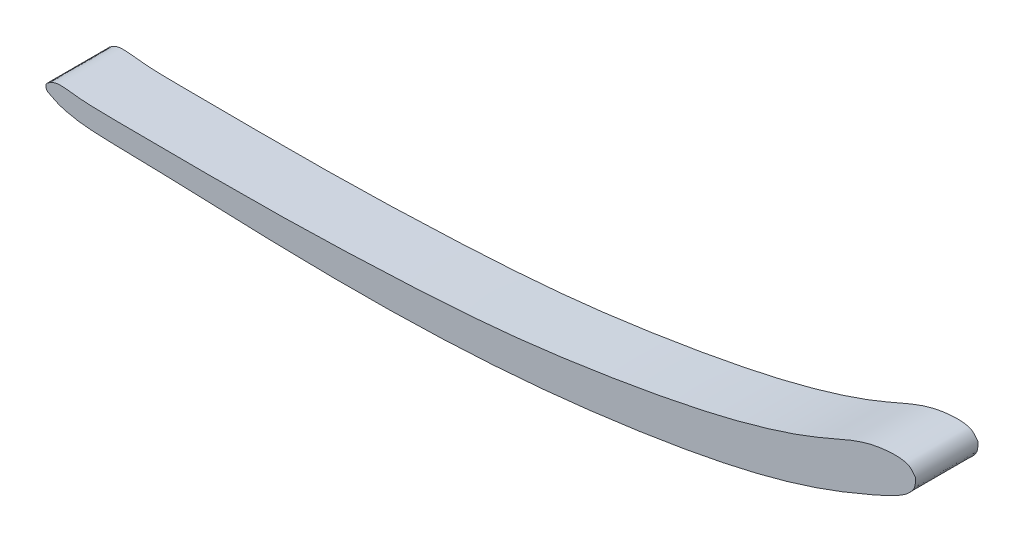
ISO-10303-21;
HEADER;
FILE_DESCRIPTION(('STEP AP214'),'2;1');
FILE_NAME('part.step','',(''),(''),'','','');
FILE_SCHEMA(('AUTOMOTIVE_DESIGN { 1 0 10303 214 1 1 1 1 }'));
ENDSEC;
DATA;
#1=APPLICATION_CONTEXT('core data for automotive mechanical design processes');
#2=APPLICATION_PROTOCOL_DEFINITION('international standard','automotive_design',2000,#1);
#3=PRODUCT_CONTEXT('',#1,'mechanical');
#4=PRODUCT('Part','Part','',(#3));
#5=PRODUCT_RELATED_PRODUCT_CATEGORY('part','',(#4));
#6=PRODUCT_DEFINITION_FORMATION('','',#4);
#7=PRODUCT_DEFINITION_CONTEXT('part definition',#1,'design');
#8=PRODUCT_DEFINITION('design','',#6,#7);
#9=PRODUCT_DEFINITION_SHAPE('','',#8);
#10=(LENGTH_UNIT() NAMED_UNIT(*) SI_UNIT(.MILLI.,.METRE.));
#11=(NAMED_UNIT(*) PLANE_ANGLE_UNIT() SI_UNIT($,.RADIAN.));
#12=(NAMED_UNIT(*) SI_UNIT($,.STERADIAN.) SOLID_ANGLE_UNIT());
#13=UNCERTAINTY_MEASURE_WITH_UNIT(LENGTH_MEASURE(1.E-05),#10,'distance_accuracy_value','');
#14=(GEOMETRIC_REPRESENTATION_CONTEXT(3) GLOBAL_UNCERTAINTY_ASSIGNED_CONTEXT((#13)) GLOBAL_UNIT_ASSIGNED_CONTEXT((#10,
#11,#12)) REPRESENTATION_CONTEXT('',''));
#15=CARTESIAN_POINT('',(0.,0.,0.));
#16=DIRECTION('',(0.,0.,1.));
#17=DIRECTION('',(1.,0.,0.));
#18=AXIS2_PLACEMENT_3D('',#15,#16,#17);
#19=CARTESIAN_POINT('',(48.7670758928868,0.,452.));
#20=CARTESIAN_POINT('',(48.7497254648279,0.0740827662938509,452.));
#21=CARTESIAN_POINT('',(48.7067217776439,0.136516019275959,452.));
#22=CARTESIAN_POINT('',(48.6154199982191,0.255582936404958,452.));
#23=CARTESIAN_POINT('',(48.5662575016845,0.312225024867621,452.));
#24=CARTESIAN_POINT('',(48.4222209018996,0.484992667480519,452.));
#25=CARTESIAN_POINT('',(48.3274450410658,0.602379406390033,452.));
#26=CARTESIAN_POINT('',(48.1681046444282,0.759034307095105,452.));
#27=CARTESIAN_POINT('',(48.1126441104831,0.808354496876898,452.));
#28=CARTESIAN_POINT('',(47.9931280971832,0.896382019506342,452.));
#29=CARTESIAN_POINT('',(47.9290124828994,0.935351489042668,452.));
#30=CARTESIAN_POINT('',(47.7268986173364,1.03809379743924,452.));
#31=CARTESIAN_POINT('',(47.5854900076979,1.0849927884317,452.));
#32=CARTESIAN_POINT('',(47.2962076676824,1.15784578134719,452.));
#33=CARTESIAN_POINT('',(47.1476139534682,1.1833346766592,452.));
#34=CARTESIAN_POINT('',(46.8517326631054,1.22235312016503,452.));
#35=CARTESIAN_POINT('',(46.7037827488454,1.23586524017212,452.));
#36=CARTESIAN_POINT('',(46.2599082213949,1.26036589713388,452.));
#37=CARTESIAN_POINT('',(45.9639603717296,1.25632041508277,452.));
#38=CARTESIAN_POINT('',(45.0760720744962,1.21523182085354,452.));
#39=CARTESIAN_POINT('',(44.4820684094531,1.14484944627981,452.));
#40=CARTESIAN_POINT('',(43.3193641040157,0.94183425841618,452.));
#41=CARTESIAN_POINT('',(42.7478625197043,0.806876546708232,452.));
#42=CARTESIAN_POINT('',(41.06193289408,0.304969277666753,452.));
#43=CARTESIAN_POINT('',(39.9739327086304,-0.152387840820362,452.));
#44=CARTESIAN_POINT('',(38.3480027976177,-0.856826882571618,452.));
#45=CARTESIAN_POINT('',(37.8067769386104,-1.09377125689791,452.));
#46=CARTESIAN_POINT('',(36.7198646832537,-1.55499712420105,452.));
#47=CARTESIAN_POINT('',(36.174661868675,-1.78065144249383,452.));
#48=CARTESIAN_POINT('',(33.4331569919698,-2.86494667065662,452.));
#49=CARTESIAN_POINT('',(31.1902480743693,-3.59127682160486,452.));
#50=CARTESIAN_POINT('',(27.7906847769972,-4.58084408227268,452.));
#51=CARTESIAN_POINT('',(26.6504299609606,-4.8926023811965,452.));
#52=CARTESIAN_POINT('',(24.3609293795843,-5.47661778907643,452.));
#53=CARTESIAN_POINT('',(23.2116172186559,-5.74954252296886,452.));
#54=CARTESIAN_POINT('',(19.7532348547084,-6.52462007681574,452.));
#55=CARTESIAN_POINT('',(17.4353140350884,-6.98605780638407,452.));
#56=CARTESIAN_POINT('',(12.7889116712947,-7.83972267611614,452.));
#57=CARTESIAN_POINT('',(10.4590882706231,-8.22980902397501,452.));
#58=CARTESIAN_POINT('',(5.78871405614241,-8.95045628419712,452.));
#59=CARTESIAN_POINT('',(3.44941303161354,-9.28109914098531,452.));
#60=CARTESIAN_POINT('',(-1.23821474322035,-9.86628590334462,452.));
#61=CARTESIAN_POINT('',(-3.58751216650595,-10.1176031342895,452.));
#62=CARTESIAN_POINT('',(-8.2950035950687,-10.5358035010109,452.));
#63=CARTESIAN_POINT('',(-10.651471646346,-10.7034295135604,452.));
#64=CARTESIAN_POINT('',(-15.3678919366527,-10.985600748811,452.));
#65=CARTESIAN_POINT('',(-17.7278763874451,-11.1022642074007,452.));
#66=CARTESIAN_POINT('',(-22.4490414460367,-11.3038235461671,452.));
#67=CARTESIAN_POINT('',(-24.8101042943478,-11.3899932922562,452.));
#68=CARTESIAN_POINT('',(-29.5334910057783,-11.5239763400097,452.));
#69=CARTESIAN_POINT('',(-31.8959944393564,-11.570210375443,452.));
#70=CARTESIAN_POINT('',(-36.6212713022019,-11.6273005256888,452.));
#71=CARTESIAN_POINT('',(-38.9841520311458,-11.6365548069584,452.));
#72=CARTESIAN_POINT('',(-43.7098696796914,-11.6352775093956,452.));
#73=CARTESIAN_POINT('',(-46.0727187121593,-11.6269204366046,452.));
#74=CARTESIAN_POINT('',(-49.6169646069428,-11.6099703473846,452.));
#75=CARTESIAN_POINT('',(-50.7983801108018,-11.6036161713158,452.));
#76=CARTESIAN_POINT('',(-52.5704624609494,-11.5893953028766,452.));
#77=CARTESIAN_POINT('',(-53.1611443692676,-11.5833245234237,452.));
#78=CARTESIAN_POINT('',(-54.3425022314735,-11.5705340415187,452.));
#79=CARTESIAN_POINT('',(-54.9332136390561,-11.5653057433111,452.));
#80=CARTESIAN_POINT('',(-56.1143585363289,-11.5448310381254,452.));
#81=CARTESIAN_POINT('',(-56.7047990772821,-11.5298294717572,452.));
#82=CARTESIAN_POINT('',(-57.8846656482999,-11.4631844495213,452.));
#83=CARTESIAN_POINT('',(-58.473627291109,-11.4124565026465,452.));
#84=CARTESIAN_POINT('',(-59.3543089683687,-11.3077364420691,452.));
#85=CARTESIAN_POINT('',(-59.6475841984144,-11.2694670492638,452.));
#86=CARTESIAN_POINT('',(-60.2359778584788,-11.2146510419916,452.));
#87=CARTESIAN_POINT('',(-60.5311758387807,-11.1954321848648,452.));
#88=CARTESIAN_POINT('',(-61.1251905990268,-11.2142844924822,452.));
#89=CARTESIAN_POINT('',(-61.4162894741541,-11.2542875794592,452.));
#90=CARTESIAN_POINT('',(-61.8327633917398,-11.418696138041,452.));
#91=CARTESIAN_POINT('',(-61.9658278318714,-11.4885774755562,452.));
#92=CARTESIAN_POINT('',(-62.1589211777255,-11.6023788896984,452.));
#93=CARTESIAN_POINT('',(-62.2221177535218,-11.6425252753731,452.));
#94=CARTESIAN_POINT('',(-62.3475097436745,-11.7243159432737,452.));
#95=CARTESIAN_POINT('',(-62.4123935128638,-11.7632506354303,452.));
#96=CARTESIAN_POINT('',(-62.5244705874295,-11.8610789324408,452.));
#97=CARTESIAN_POINT('',(-62.5671467169348,-11.9251697878468,452.));
#98=CARTESIAN_POINT('',(-62.6125235285145,-12.0675006456061,452.));
#99=CARTESIAN_POINT('',(-62.613939033113,-12.1433230636552,452.));
#100=CARTESIAN_POINT('',(-62.6033317693744,-12.2922420009066,452.));
#101=CARTESIAN_POINT('',(-62.5960941482521,-12.3663427278552,452.));
#102=CARTESIAN_POINT('',(-62.5663235399886,-12.5117069967733,452.));
#103=CARTESIAN_POINT('',(-62.5418622142156,-12.5855939018617,452.));
#104=CARTESIAN_POINT('',(-62.4512475547232,-12.70652378792,452.));
#105=CARTESIAN_POINT('',(-62.3847863108805,-12.7480738623129,452.));
#106=CARTESIAN_POINT('',(-62.2488430941017,-12.8163106707967,452.));
#107=CARTESIAN_POINT('',(-62.1784365122723,-12.8454898907971,452.));
#108=CARTESIAN_POINT('',(-61.9721190522645,-12.9429715160153,452.));
#109=CARTESIAN_POINT('',(-61.8377489923524,-13.0144003182606,452.));
#110=CARTESIAN_POINT('',(-61.5686291955103,-13.1564868750069,452.));
#111=CARTESIAN_POINT('',(-61.4337687475532,-13.2266621344774,452.));
#112=CARTESIAN_POINT('',(-61.1588366785261,-13.35196223336,452.));
#113=CARTESIAN_POINT('',(-61.0191343096418,-13.4081535122056,452.));
#114=CARTESIAN_POINT('',(-60.5951678987614,-13.5626931633041,452.));
#115=CARTESIAN_POINT('',(-60.3061496094948,-13.647310765741,452.));
#116=CARTESIAN_POINT('',(-59.4299696077976,-13.8748092195757,452.));
#117=CARTESIAN_POINT('',(-58.8324867066115,-13.985333822266,452.));
#118=CARTESIAN_POINT('',(-57.6375470633708,-14.1405549803438,452.));
#119=CARTESIAN_POINT('',(-57.0370986907019,-14.1878156147729,452.));
#120=CARTESIAN_POINT('',(-55.8338836510183,-14.258714624409,452.));
#121=CARTESIAN_POINT('',(-55.2308622435226,-14.2810136527918,452.));
#122=CARTESIAN_POINT('',(-54.0245578207249,-14.3162776136557,452.));
#123=CARTESIAN_POINT('',(-53.421293552161,-14.3295494088006,452.));
#124=CARTESIAN_POINT('',(-51.6114354418203,-14.3668237664572,452.));
#125=CARTESIAN_POINT('',(-50.4048594045184,-14.3915191075956,452.));
#126=CARTESIAN_POINT('',(-46.7856834707029,-14.4870905825138,452.));
#127=CARTESIAN_POINT('',(-44.3735231153865,-14.5748331562397,452.));
#128=CARTESIAN_POINT('',(-39.549215852833,-14.7486110429816,452.));
#129=CARTESIAN_POINT('',(-37.1370744043041,-14.8359036449077,452.));
#130=CARTESIAN_POINT('',(-29.8990338157463,-15.0442294678019,452.));
#131=CARTESIAN_POINT('',(-25.0708323826463,-15.1147364237721,452.));
#132=CARTESIAN_POINT('',(-15.4190183613517,-15.0189135055241,452.));
#133=CARTESIAN_POINT('',(-10.5920470452786,-14.8587114468771,452.));
#134=CARTESIAN_POINT('',(-3.36570033927103,-14.3907581524578,452.));
#135=CARTESIAN_POINT('',(-0.958898373609102,-14.1972992765851,452.));
#136=CARTESIAN_POINT('',(3.84639008640487,-13.733984402616,452.));
#137=CARTESIAN_POINT('',(6.24597894327379,-13.464247654687,452.));
#138=CARTESIAN_POINT('',(11.0343190229734,-12.8564044063609,452.));
#139=CARTESIAN_POINT('',(13.4229379490215,-12.5168685673401,452.));
#140=CARTESIAN_POINT('',(18.1882098324596,-11.7610269663621,452.));
#141=CARTESIAN_POINT('',(20.5648296286902,-11.3445084527484,452.));
#142=CARTESIAN_POINT('',(25.3004231553569,-10.3982597708789,452.));
#143=CARTESIAN_POINT('',(27.6562988017543,-9.87023161473323,452.));
#144=CARTESIAN_POINT('',(32.3250334497104,-8.64177002445156,452.));
#145=CARTESIAN_POINT('',(34.6381049365638,-7.9404632185809,452.));
#146=CARTESIAN_POINT('',(39.1930045270877,-6.33490835304029,452.));
#147=CARTESIAN_POINT('',(41.4350257134755,-5.43044769553383,452.));
#148=CARTESIAN_POINT('',(44.1947852232434,-4.20574194263276,452.));
#149=CARTESIAN_POINT('',(44.7447739514421,-3.95600097979187,452.));
#150=CARTESIAN_POINT('',(45.5610726617815,-3.5636870955519,452.));
#151=CARTESIAN_POINT('',(45.8314852015778,-3.4294320471486,452.));
#152=CARTESIAN_POINT('',(46.3663185092759,-3.14854881333451,452.));
#153=CARTESIAN_POINT('',(46.630554478725,-3.0029479263339,452.));
#154=CARTESIAN_POINT('',(47.1441823735746,-2.68911028409886,452.));
#155=CARTESIAN_POINT('',(47.39352585791,-2.52067502899955,452.));
#156=CARTESIAN_POINT('',(47.8657987765788,-2.14308473216968,452.));
#157=CARTESIAN_POINT('',(48.0867614839593,-1.93309097021276,452.));
#158=CARTESIAN_POINT('',(48.373117175578,-1.5816854514575,452.));
#159=CARTESIAN_POINT('',(48.4625143970022,-1.45717215381572,452.));
#160=CARTESIAN_POINT('',(48.6119331009041,-1.19450152359436,452.));
#161=CARTESIAN_POINT('',(48.6733833474199,-1.05542565311527,452.));
#162=CARTESIAN_POINT('',(48.7419649909929,-0.757348809598726,452.));
#163=CARTESIAN_POINT('',(48.7453683958644,-0.605391610038072,452.));
#164=CARTESIAN_POINT('',(48.753994442435,-0.377788529985074,452.));
#165=CARTESIAN_POINT('',(48.7601868420806,-0.302238522510115,452.));
#166=CARTESIAN_POINT('',(48.7743874651611,-0.151282142850637,452.));
#167=CARTESIAN_POINT('',(48.7844263209457,-0.074082766293837,452.));
#168=CARTESIAN_POINT('',(48.7670758928868,0.,452.));
#169=B_SPLINE_CURVE_WITH_KNOTS('',3,(#19,#20,#21,#22,#23,#24,#25,#26,#27,#28,#29,#30,#31,#32,
#33,#34,#35,#36,#37,#38,#39,#40,#41,#42,#43,#44,#45,#46,#47,#48,#49,#50,#51,#52,#53,#54,#55,#56,
#57,#58,#59,#60,#61,#62,#63,#64,#65,#66,#67,#68,#69,#70,#71,#72,#73,#74,#75,#76,#77,#78,#79,#80,
#81,#82,#83,#84,#85,#86,#87,#88,#89,#90,#91,#92,#93,#94,#95,#96,#97,#98,#99,#100,#101,#102,#103,
#104,#105,#106,#107,#108,#109,#110,#111,#112,#113,#114,#115,#116,#117,#118,#119,#120,#121,#122,
#123,#124,#125,#126,#127,#128,#129,#130,#131,#132,#133,#134,#135,#136,#137,#138,#139,#140,#141,
#142,#143,#144,#145,#146,#147,#148,#149,#150,#151,#152,#153,#154,#155,#156,#157,#158,#159,#160,
#161,#162,#163,#164,#165,#166,#167,#168),.UNSPECIFIED.,.T.,.F.,(4,2,2,2,2,2,2,2,2,2,2,2,2,2,2,2,
2,2,2,2,2,2,2,2,2,2,2,2,2,2,2,2,2,2,2,2,2,2,2,2,2,2,2,2,2,2,2,2,2,2,2,2,2,2,2,2,2,2,2,2,2,2,2,2,
2,2,2,2,2,2,2,2,2,2,4),(0.,0.000976562500000058,0.00195312500000011,0.00390625000000017,
0.00488281250000023,0.0058593750000003,0.00781250000000034,0.00976562500000038,
0.0117187500000004,0.0156250000000004,0.0234375000000003,0.0312500000000002,0.0468750000000001,
0.0546875,0.0625,0.0937499999999998,0.109375,0.125,0.156249999999999,0.187499999999999,
0.218749999999999,0.249999999999998,0.281249999999998,0.312499999999998,0.343749999999998,
0.374999999999997,0.406249999999997,0.437499999999997,0.453124999999997,0.460937499999997,
0.468749999999997,0.476562499999997,0.484374999999997,0.488281249999997,0.492187499999997,
0.496093749999997,0.498046874999997,0.499023437499997,0.499999999999997,0.500976562499997,
0.501953124999997,0.502929687499997,0.503906249999997,0.504882812499997,0.505859374999997,
0.507812499999997,0.509765624999997,0.511718749999997,0.515624999999997,0.523437499999997,
0.531249999999997,0.539062499999997,0.546874999999998,0.562499999999998,0.593749999999998,
0.624999999999998,0.687499999999998,0.749999999999999,0.781249999999999,0.812499999999999,
0.843749999999999,0.875,0.90625,0.9375,0.96875,0.9765625,0.98046875,0.984375,0.98828125,
0.9921875,0.994140625,0.99609375,0.998046875,0.9990234375,1.),.UNSPECIFIED.);
#170=DIRECTION('',(0.,0.,-1.));
#171=VECTOR('',#170,1.);
#172=SURFACE_OF_LINEAR_EXTRUSION('',#169,#171);
#173=CARTESIAN_POINT('',(48.7670758928868,0.,452.));
#174=CARTESIAN_POINT('',(48.7844263209457,-0.074082766293837,452.));
#175=CARTESIAN_POINT('',(48.7743874651611,-0.151282142850637,452.));
#176=CARTESIAN_POINT('',(48.7601868420806,-0.302238522510115,452.));
#177=CARTESIAN_POINT('',(48.753994442435,-0.377788529985074,452.));
#178=CARTESIAN_POINT('',(48.7453683958644,-0.605391610038072,452.));
#179=CARTESIAN_POINT('',(48.7419649909929,-0.757348809598726,452.));
#180=CARTESIAN_POINT('',(48.6733833474199,-1.05542565311527,452.));
#181=CARTESIAN_POINT('',(48.6119331009041,-1.19450152359436,452.));
#182=CARTESIAN_POINT('',(48.4625143970022,-1.45717215381572,452.));
#183=CARTESIAN_POINT('',(48.373117175578,-1.5816854514575,452.));
#184=CARTESIAN_POINT('',(48.0867614839593,-1.93309097021276,452.));
#185=CARTESIAN_POINT('',(47.8657987765788,-2.14308473216968,452.));
#186=CARTESIAN_POINT('',(47.39352585791,-2.52067502899955,452.));
#187=CARTESIAN_POINT('',(47.1441823735746,-2.68911028409886,452.));
#188=CARTESIAN_POINT('',(46.630554478725,-3.0029479263339,452.));
#189=CARTESIAN_POINT('',(46.3663185092759,-3.14854881333451,452.));
#190=CARTESIAN_POINT('',(45.8314852015778,-3.4294320471486,452.));
#191=CARTESIAN_POINT('',(45.5610726617815,-3.5636870955519,452.));
#192=CARTESIAN_POINT('',(44.7447739514421,-3.95600097979187,452.));
#193=CARTESIAN_POINT('',(44.1947852232434,-4.20574194263276,452.));
#194=CARTESIAN_POINT('',(41.4350257134755,-5.43044769553383,452.));
#195=CARTESIAN_POINT('',(39.1930045270877,-6.33490835304029,452.));
#196=CARTESIAN_POINT('',(34.6381049365638,-7.9404632185809,452.));
#197=CARTESIAN_POINT('',(32.3250334497104,-8.64177002445156,452.));
#198=CARTESIAN_POINT('',(27.6562988017543,-9.87023161473323,452.));
#199=CARTESIAN_POINT('',(25.3004231553569,-10.3982597708789,452.));
#200=CARTESIAN_POINT('',(20.5648296286902,-11.3445084527484,452.));
#201=CARTESIAN_POINT('',(18.1882098324596,-11.7610269663621,452.));
#202=CARTESIAN_POINT('',(13.4229379490215,-12.5168685673401,452.));
#203=CARTESIAN_POINT('',(11.0343190229734,-12.8564044063609,452.));
#204=CARTESIAN_POINT('',(6.24597894327379,-13.464247654687,452.));
#205=CARTESIAN_POINT('',(3.84639008640487,-13.733984402616,452.));
#206=CARTESIAN_POINT('',(-0.958898373609102,-14.1972992765851,452.));
#207=CARTESIAN_POINT('',(-3.36570033927103,-14.3907581524578,452.));
#208=CARTESIAN_POINT('',(-10.5920470452786,-14.8587114468771,452.));
#209=CARTESIAN_POINT('',(-15.4190183613517,-15.0189135055241,452.));
#210=CARTESIAN_POINT('',(-25.0708323826463,-15.1147364237721,452.));
#211=CARTESIAN_POINT('',(-29.8990338157463,-15.0442294678019,452.));
#212=CARTESIAN_POINT('',(-37.1370744043041,-14.8359036449077,452.));
#213=CARTESIAN_POINT('',(-39.549215852833,-14.7486110429816,452.));
#214=CARTESIAN_POINT('',(-44.3735231153865,-14.5748331562397,452.));
#215=CARTESIAN_POINT('',(-46.7856834707029,-14.4870905825138,452.));
#216=CARTESIAN_POINT('',(-50.4048594045184,-14.3915191075956,452.));
#217=CARTESIAN_POINT('',(-51.6114354418203,-14.3668237664572,452.));
#218=CARTESIAN_POINT('',(-53.421293552161,-14.3295494088006,452.));
#219=CARTESIAN_POINT('',(-54.0245578207249,-14.3162776136557,452.));
#220=CARTESIAN_POINT('',(-55.2308622435226,-14.2810136527918,452.));
#221=CARTESIAN_POINT('',(-55.8338836510183,-14.258714624409,452.));
#222=CARTESIAN_POINT('',(-57.0370986907019,-14.1878156147729,452.));
#223=CARTESIAN_POINT('',(-57.6375470633708,-14.1405549803438,452.));
#224=CARTESIAN_POINT('',(-58.8324867066115,-13.985333822266,452.));
#225=CARTESIAN_POINT('',(-59.4299696077976,-13.8748092195757,452.));
#226=CARTESIAN_POINT('',(-60.3061496094948,-13.647310765741,452.));
#227=CARTESIAN_POINT('',(-60.5951678987614,-13.5626931633041,452.));
#228=CARTESIAN_POINT('',(-61.0191343096418,-13.4081535122056,452.));
#229=CARTESIAN_POINT('',(-61.1588366785261,-13.35196223336,452.));
#230=CARTESIAN_POINT('',(-61.4337687475532,-13.2266621344774,452.));
#231=CARTESIAN_POINT('',(-61.5686291955103,-13.1564868750069,452.));
#232=CARTESIAN_POINT('',(-61.8377489923524,-13.0144003182606,452.));
#233=CARTESIAN_POINT('',(-61.9721190522645,-12.9429715160153,452.));
#234=CARTESIAN_POINT('',(-62.1784365122723,-12.8454898907971,452.));
#235=CARTESIAN_POINT('',(-62.2488430941017,-12.8163106707967,452.));
#236=CARTESIAN_POINT('',(-62.3847863108805,-12.7480738623129,452.));
#237=CARTESIAN_POINT('',(-62.4512475547232,-12.70652378792,452.));
#238=CARTESIAN_POINT('',(-62.5418622142156,-12.5855939018617,452.));
#239=CARTESIAN_POINT('',(-62.5663235399886,-12.5117069967733,452.));
#240=CARTESIAN_POINT('',(-62.5960941482521,-12.3663427278552,452.));
#241=CARTESIAN_POINT('',(-62.6033317693744,-12.2922420009066,452.));
#242=CARTESIAN_POINT('',(-62.613939033113,-12.1433230636552,452.));
#243=CARTESIAN_POINT('',(-62.6125235285145,-12.0675006456061,452.));
#244=CARTESIAN_POINT('',(-62.5671467169348,-11.9251697878468,452.));
#245=CARTESIAN_POINT('',(-62.5244705874295,-11.8610789324408,452.));
#246=CARTESIAN_POINT('',(-62.4123935128638,-11.7632506354303,452.));
#247=CARTESIAN_POINT('',(-62.3475097436745,-11.7243159432737,452.));
#248=CARTESIAN_POINT('',(-62.2221177535218,-11.6425252753731,452.));
#249=CARTESIAN_POINT('',(-62.1589211777255,-11.6023788896984,452.));
#250=CARTESIAN_POINT('',(-61.9658278318714,-11.4885774755562,452.));
#251=CARTESIAN_POINT('',(-61.8327633917398,-11.418696138041,452.));
#252=CARTESIAN_POINT('',(-61.4162894741541,-11.2542875794592,452.));
#253=CARTESIAN_POINT('',(-61.1251905990268,-11.2142844924822,452.));
#254=CARTESIAN_POINT('',(-60.5311758387807,-11.1954321848648,452.));
#255=CARTESIAN_POINT('',(-60.2359778584788,-11.2146510419916,452.));
#256=CARTESIAN_POINT('',(-59.6475841984144,-11.2694670492638,452.));
#257=CARTESIAN_POINT('',(-59.3543089683687,-11.3077364420691,452.));
#258=CARTESIAN_POINT('',(-58.473627291109,-11.4124565026465,452.));
#259=CARTESIAN_POINT('',(-57.8846656482999,-11.4631844495213,452.));
#260=CARTESIAN_POINT('',(-56.7047990772821,-11.5298294717572,452.));
#261=CARTESIAN_POINT('',(-56.1143585363289,-11.5448310381254,452.));
#262=CARTESIAN_POINT('',(-54.9332136390561,-11.5653057433111,452.));
#263=CARTESIAN_POINT('',(-54.3425022314735,-11.5705340415187,452.));
#264=CARTESIAN_POINT('',(-53.1611443692676,-11.5833245234237,452.));
#265=CARTESIAN_POINT('',(-52.5704624609494,-11.5893953028766,452.));
#266=CARTESIAN_POINT('',(-50.7983801108018,-11.6036161713158,452.));
#267=CARTESIAN_POINT('',(-49.6169646069428,-11.6099703473846,452.));
#268=CARTESIAN_POINT('',(-46.0727187121593,-11.6269204366046,452.));
#269=CARTESIAN_POINT('',(-43.7098696796914,-11.6352775093956,452.));
#270=CARTESIAN_POINT('',(-38.9841520311458,-11.6365548069584,452.));
#271=CARTESIAN_POINT('',(-36.6212713022019,-11.6273005256888,452.));
#272=CARTESIAN_POINT('',(-31.8959944393564,-11.570210375443,452.));
#273=CARTESIAN_POINT('',(-29.5334910057783,-11.5239763400097,452.));
#274=CARTESIAN_POINT('',(-24.8101042943478,-11.3899932922562,452.));
#275=CARTESIAN_POINT('',(-22.4490414460367,-11.3038235461671,452.));
#276=CARTESIAN_POINT('',(-17.7278763874451,-11.1022642074007,452.));
#277=CARTESIAN_POINT('',(-15.3678919366527,-10.985600748811,452.));
#278=CARTESIAN_POINT('',(-10.651471646346,-10.7034295135604,452.));
#279=CARTESIAN_POINT('',(-8.2950035950687,-10.5358035010109,452.));
#280=CARTESIAN_POINT('',(-3.58751216650595,-10.1176031342895,452.));
#281=CARTESIAN_POINT('',(-1.23821474322035,-9.86628590334462,452.));
#282=CARTESIAN_POINT('',(3.44941303161354,-9.28109914098531,452.));
#283=CARTESIAN_POINT('',(5.78871405614241,-8.95045628419712,452.));
#284=CARTESIAN_POINT('',(10.4590882706231,-8.22980902397501,452.));
#285=CARTESIAN_POINT('',(12.7889116712947,-7.83972267611614,452.));
#286=CARTESIAN_POINT('',(17.4353140350884,-6.98605780638407,452.));
#287=CARTESIAN_POINT('',(19.7532348547084,-6.52462007681574,452.));
#288=CARTESIAN_POINT('',(23.2116172186559,-5.74954252296886,452.));
#289=CARTESIAN_POINT('',(24.3609293795843,-5.47661778907643,452.));
#290=CARTESIAN_POINT('',(26.6504299609606,-4.8926023811965,452.));
#291=CARTESIAN_POINT('',(27.7906847769972,-4.58084408227268,452.));
#292=CARTESIAN_POINT('',(31.1902480743693,-3.59127682160486,452.));
#293=CARTESIAN_POINT('',(33.4331569919698,-2.86494667065662,452.));
#294=CARTESIAN_POINT('',(36.174661868675,-1.78065144249383,452.));
#295=CARTESIAN_POINT('',(36.7198646832537,-1.55499712420105,452.));
#296=CARTESIAN_POINT('',(37.8067769386104,-1.09377125689791,452.));
#297=CARTESIAN_POINT('',(38.3480027976177,-0.856826882571618,452.));
#298=CARTESIAN_POINT('',(39.9739327086304,-0.152387840820362,452.));
#299=CARTESIAN_POINT('',(41.06193289408,0.304969277666753,452.));
#300=CARTESIAN_POINT('',(42.7478625197043,0.806876546708232,452.));
#301=CARTESIAN_POINT('',(43.3193641040157,0.94183425841618,452.));
#302=CARTESIAN_POINT('',(44.4820684094531,1.14484944627981,452.));
#303=CARTESIAN_POINT('',(45.0760720744962,1.21523182085354,452.));
#304=CARTESIAN_POINT('',(45.9639603717296,1.25632041508277,452.));
#305=CARTESIAN_POINT('',(46.2599082213949,1.26036589713388,452.));
#306=CARTESIAN_POINT('',(46.7037827488454,1.23586524017212,452.));
#307=CARTESIAN_POINT('',(46.8517326631054,1.22235312016503,452.));
#308=CARTESIAN_POINT('',(47.1476139534682,1.1833346766592,452.));
#309=CARTESIAN_POINT('',(47.2962076676824,1.15784578134719,452.));
#310=CARTESIAN_POINT('',(47.5854900076979,1.0849927884317,452.));
#311=CARTESIAN_POINT('',(47.7268986173364,1.03809379743924,452.));
#312=CARTESIAN_POINT('',(47.9290124828994,0.935351489042668,452.));
#313=CARTESIAN_POINT('',(47.9931280971832,0.896382019506342,452.));
#314=CARTESIAN_POINT('',(48.1126441104831,0.808354496876898,452.));
#315=CARTESIAN_POINT('',(48.1681046444282,0.759034307095105,452.));
#316=CARTESIAN_POINT('',(48.3274450410658,0.602379406390033,452.));
#317=CARTESIAN_POINT('',(48.4222209018996,0.484992667480519,452.));
#318=CARTESIAN_POINT('',(48.5662575016845,0.312225024867621,452.));
#319=CARTESIAN_POINT('',(48.6154199982191,0.255582936404958,452.));
#320=CARTESIAN_POINT('',(48.7067217776439,0.136516019275959,452.));
#321=CARTESIAN_POINT('',(48.7497254648279,0.0740827662938509,452.));
#322=CARTESIAN_POINT('',(48.7670758928868,0.,452.));
#323=B_SPLINE_CURVE_WITH_KNOTS('',3,(#173,#174,#175,#176,#177,#178,#179,#180,#181,#182,#183,
#184,#185,#186,#187,#188,#189,#190,#191,#192,#193,#194,#195,#196,#197,#198,#199,#200,#201,#202,
#203,#204,#205,#206,#207,#208,#209,#210,#211,#212,#213,#214,#215,#216,#217,#218,#219,#220,#221,
#222,#223,#224,#225,#226,#227,#228,#229,#230,#231,#232,#233,#234,#235,#236,#237,#238,#239,#240,
#241,#242,#243,#244,#245,#246,#247,#248,#249,#250,#251,#252,#253,#254,#255,#256,#257,#258,#259,
#260,#261,#262,#263,#264,#265,#266,#267,#268,#269,#270,#271,#272,#273,#274,#275,#276,#277,#278,
#279,#280,#281,#282,#283,#284,#285,#286,#287,#288,#289,#290,#291,#292,#293,#294,#295,#296,#297,
#298,#299,#300,#301,#302,#303,#304,#305,#306,#307,#308,#309,#310,#311,#312,#313,#314,#315,#316,
#317,#318,#319,#320,#321,#322),.UNSPECIFIED.,.T.,.F.,(4,2,2,2,2,2,2,2,2,2,2,2,2,2,2,2,2,2,2,2,2,
2,2,2,2,2,2,2,2,2,2,2,2,2,2,2,2,2,2,2,2,2,2,2,2,2,2,2,2,2,2,2,2,2,2,2,2,2,2,2,2,2,2,2,2,2,2,2,2,
2,2,2,2,2,4),(0.,0.000976562499999889,0.00195312499999978,0.00390624999999978,
0.00585937499999978,0.00781249999999978,0.0117187499999998,0.0156249999999998,
0.0195312499999998,0.0234374999999998,0.0312499999999999,0.0625,0.0937500000000002,0.125,
0.156250000000001,0.187500000000001,0.218750000000001,0.250000000000001,0.312500000000002,
0.375000000000002,0.406250000000002,0.437500000000002,0.453125000000002,0.460937500000003,
0.468750000000003,0.476562500000003,0.484375000000003,0.488281250000003,0.490234375000003,
0.492187500000003,0.494140625000003,0.495117187500003,0.496093750000003,0.497070312500003,
0.498046875000003,0.499023437500003,0.500000000000003,0.500976562500003,0.501953125000003,
0.503906250000003,0.507812500000003,0.511718750000003,0.515625000000003,0.523437500000003,
0.531250000000003,0.539062500000003,0.546875000000003,0.562500000000003,0.593750000000003,
0.625000000000003,0.656250000000002,0.687500000000002,0.718750000000002,0.750000000000002,
0.781250000000001,0.812500000000001,0.843750000000001,0.875,0.890625,0.90625,0.9375,0.9453125,
0.953125,0.96875,0.9765625,0.984375,0.98828125,0.990234375,0.9921875,0.994140625,0.9951171875,
0.99609375,0.998046875,0.9990234375,1.),.UNSPECIFIED.);
#324=CARTESIAN_POINT('',(48.7670758928868,0.,452.));
#325=VERTEX_POINT('',#324);
#326=EDGE_CURVE('E10',#325,#325,#323,.F.);
#327=ORIENTED_EDGE('',*,*,#326,.F.);
#328=EDGE_LOOP('',(#327));
#329=FACE_BOUND('',#328,.T.);
#330=CARTESIAN_POINT('',(48.7670758928868,0.,444.));
#331=CARTESIAN_POINT('',(48.7497254648279,0.0740827662938509,444.));
#332=CARTESIAN_POINT('',(48.7067217776439,0.136516019275959,444.));
#333=CARTESIAN_POINT('',(48.6154199982191,0.255582936404958,444.));
#334=CARTESIAN_POINT('',(48.5662575016845,0.312225024867621,444.));
#335=CARTESIAN_POINT('',(48.4222209018996,0.484992667480519,444.));
#336=CARTESIAN_POINT('',(48.3274450410658,0.602379406390033,444.));
#337=CARTESIAN_POINT('',(48.1681046444282,0.759034307095105,444.));
#338=CARTESIAN_POINT('',(48.1126441104831,0.808354496876898,444.));
#339=CARTESIAN_POINT('',(47.9931280971832,0.896382019506342,444.));
#340=CARTESIAN_POINT('',(47.9290124828994,0.935351489042668,444.));
#341=CARTESIAN_POINT('',(47.7268986173364,1.03809379743924,444.));
#342=CARTESIAN_POINT('',(47.5854900076979,1.0849927884317,444.));
#343=CARTESIAN_POINT('',(47.2962076676824,1.15784578134719,444.));
#344=CARTESIAN_POINT('',(47.1476139534682,1.1833346766592,444.));
#345=CARTESIAN_POINT('',(46.8517326631054,1.22235312016503,444.));
#346=CARTESIAN_POINT('',(46.7037827488454,1.23586524017212,444.));
#347=CARTESIAN_POINT('',(46.2599082213949,1.26036589713388,444.));
#348=CARTESIAN_POINT('',(45.9639603717296,1.25632041508277,444.));
#349=CARTESIAN_POINT('',(45.0760720744962,1.21523182085354,444.));
#350=CARTESIAN_POINT('',(44.4820684094531,1.14484944627981,444.));
#351=CARTESIAN_POINT('',(43.3193641040157,0.94183425841618,444.));
#352=CARTESIAN_POINT('',(42.7478625197043,0.806876546708232,444.));
#353=CARTESIAN_POINT('',(41.06193289408,0.304969277666753,444.));
#354=CARTESIAN_POINT('',(39.9739327086304,-0.152387840820362,444.));
#355=CARTESIAN_POINT('',(38.3480027976177,-0.856826882571618,444.));
#356=CARTESIAN_POINT('',(37.8067769386104,-1.09377125689791,444.));
#357=CARTESIAN_POINT('',(36.7198646832537,-1.55499712420105,444.));
#358=CARTESIAN_POINT('',(36.174661868675,-1.78065144249383,444.));
#359=CARTESIAN_POINT('',(33.4331569919698,-2.86494667065662,444.));
#360=CARTESIAN_POINT('',(31.1902480743693,-3.59127682160486,444.));
#361=CARTESIAN_POINT('',(27.7906847769972,-4.58084408227268,444.));
#362=CARTESIAN_POINT('',(26.6504299609606,-4.8926023811965,444.));
#363=CARTESIAN_POINT('',(24.3609293795843,-5.47661778907643,444.));
#364=CARTESIAN_POINT('',(23.2116172186559,-5.74954252296886,444.));
#365=CARTESIAN_POINT('',(19.7532348547084,-6.52462007681574,444.));
#366=CARTESIAN_POINT('',(17.4353140350884,-6.98605780638407,444.));
#367=CARTESIAN_POINT('',(12.7889116712947,-7.83972267611614,444.));
#368=CARTESIAN_POINT('',(10.4590882706231,-8.22980902397501,444.));
#369=CARTESIAN_POINT('',(5.78871405614241,-8.95045628419712,444.));
#370=CARTESIAN_POINT('',(3.44941303161354,-9.28109914098531,444.));
#371=CARTESIAN_POINT('',(-1.23821474322035,-9.86628590334462,444.));
#372=CARTESIAN_POINT('',(-3.58751216650595,-10.1176031342895,444.));
#373=CARTESIAN_POINT('',(-8.2950035950687,-10.5358035010109,444.));
#374=CARTESIAN_POINT('',(-10.651471646346,-10.7034295135604,444.));
#375=CARTESIAN_POINT('',(-15.3678919366527,-10.985600748811,444.));
#376=CARTESIAN_POINT('',(-17.7278763874451,-11.1022642074007,444.));
#377=CARTESIAN_POINT('',(-22.4490414460367,-11.3038235461671,444.));
#378=CARTESIAN_POINT('',(-24.8101042943478,-11.3899932922562,444.));
#379=CARTESIAN_POINT('',(-29.5334910057783,-11.5239763400097,444.));
#380=CARTESIAN_POINT('',(-31.8959944393564,-11.570210375443,444.));
#381=CARTESIAN_POINT('',(-36.6212713022019,-11.6273005256888,444.));
#382=CARTESIAN_POINT('',(-38.9841520311458,-11.6365548069584,444.));
#383=CARTESIAN_POINT('',(-43.7098696796914,-11.6352775093956,444.));
#384=CARTESIAN_POINT('',(-46.0727187121593,-11.6269204366046,444.));
#385=CARTESIAN_POINT('',(-49.6169646069428,-11.6099703473846,444.));
#386=CARTESIAN_POINT('',(-50.7983801108018,-11.6036161713158,444.));
#387=CARTESIAN_POINT('',(-52.5704624609494,-11.5893953028766,444.));
#388=CARTESIAN_POINT('',(-53.1611443692676,-11.5833245234237,444.));
#389=CARTESIAN_POINT('',(-54.3425022314735,-11.5705340415187,444.));
#390=CARTESIAN_POINT('',(-54.9332136390561,-11.5653057433111,444.));
#391=CARTESIAN_POINT('',(-56.1143585363289,-11.5448310381254,444.));
#392=CARTESIAN_POINT('',(-56.7047990772821,-11.5298294717572,444.));
#393=CARTESIAN_POINT('',(-57.8846656482999,-11.4631844495213,444.));
#394=CARTESIAN_POINT('',(-58.473627291109,-11.4124565026465,444.));
#395=CARTESIAN_POINT('',(-59.3543089683687,-11.3077364420691,444.));
#396=CARTESIAN_POINT('',(-59.6475841984144,-11.2694670492638,444.));
#397=CARTESIAN_POINT('',(-60.2359778584788,-11.2146510419916,444.));
#398=CARTESIAN_POINT('',(-60.5311758387807,-11.1954321848648,444.));
#399=CARTESIAN_POINT('',(-61.1251905990268,-11.2142844924822,444.));
#400=CARTESIAN_POINT('',(-61.4162894741541,-11.2542875794592,444.));
#401=CARTESIAN_POINT('',(-61.8327633917398,-11.418696138041,444.));
#402=CARTESIAN_POINT('',(-61.9658278318714,-11.4885774755562,444.));
#403=CARTESIAN_POINT('',(-62.1589211777255,-11.6023788896984,444.));
#404=CARTESIAN_POINT('',(-62.2221177535218,-11.6425252753731,444.));
#405=CARTESIAN_POINT('',(-62.3475097436745,-11.7243159432737,444.));
#406=CARTESIAN_POINT('',(-62.4123935128638,-11.7632506354303,444.));
#407=CARTESIAN_POINT('',(-62.5244705874295,-11.8610789324408,444.));
#408=CARTESIAN_POINT('',(-62.5671467169348,-11.9251697878468,444.));
#409=CARTESIAN_POINT('',(-62.6125235285145,-12.0675006456061,444.));
#410=CARTESIAN_POINT('',(-62.613939033113,-12.1433230636552,444.));
#411=CARTESIAN_POINT('',(-62.6033317693744,-12.2922420009066,444.));
#412=CARTESIAN_POINT('',(-62.5960941482521,-12.3663427278552,444.));
#413=CARTESIAN_POINT('',(-62.5663235399886,-12.5117069967733,444.));
#414=CARTESIAN_POINT('',(-62.5418622142156,-12.5855939018617,444.));
#415=CARTESIAN_POINT('',(-62.4512475547232,-12.70652378792,444.));
#416=CARTESIAN_POINT('',(-62.3847863108805,-12.7480738623129,444.));
#417=CARTESIAN_POINT('',(-62.2488430941017,-12.8163106707967,444.));
#418=CARTESIAN_POINT('',(-62.1784365122723,-12.8454898907971,444.));
#419=CARTESIAN_POINT('',(-61.9721190522645,-12.9429715160153,444.));
#420=CARTESIAN_POINT('',(-61.8377489923524,-13.0144003182606,444.));
#421=CARTESIAN_POINT('',(-61.5686291955103,-13.1564868750069,444.));
#422=CARTESIAN_POINT('',(-61.4337687475532,-13.2266621344774,444.));
#423=CARTESIAN_POINT('',(-61.1588366785261,-13.35196223336,444.));
#424=CARTESIAN_POINT('',(-61.0191343096418,-13.4081535122056,444.));
#425=CARTESIAN_POINT('',(-60.5951678987614,-13.5626931633041,444.));
#426=CARTESIAN_POINT('',(-60.3061496094948,-13.647310765741,444.));
#427=CARTESIAN_POINT('',(-59.4299696077976,-13.8748092195757,444.));
#428=CARTESIAN_POINT('',(-58.8324867066115,-13.985333822266,444.));
#429=CARTESIAN_POINT('',(-57.6375470633708,-14.1405549803438,444.));
#430=CARTESIAN_POINT('',(-57.0370986907019,-14.1878156147729,444.));
#431=CARTESIAN_POINT('',(-55.8338836510183,-14.258714624409,444.));
#432=CARTESIAN_POINT('',(-55.2308622435226,-14.2810136527918,444.));
#433=CARTESIAN_POINT('',(-54.0245578207249,-14.3162776136557,444.));
#434=CARTESIAN_POINT('',(-53.421293552161,-14.3295494088006,444.));
#435=CARTESIAN_POINT('',(-51.6114354418203,-14.3668237664572,444.));
#436=CARTESIAN_POINT('',(-50.4048594045184,-14.3915191075956,444.));
#437=CARTESIAN_POINT('',(-46.7856834707029,-14.4870905825138,444.));
#438=CARTESIAN_POINT('',(-44.3735231153865,-14.5748331562397,444.));
#439=CARTESIAN_POINT('',(-39.549215852833,-14.7486110429816,444.));
#440=CARTESIAN_POINT('',(-37.1370744043041,-14.8359036449077,444.));
#441=CARTESIAN_POINT('',(-29.8990338157463,-15.0442294678019,444.));
#442=CARTESIAN_POINT('',(-25.0708323826463,-15.1147364237721,444.));
#443=CARTESIAN_POINT('',(-15.4190183613517,-15.0189135055241,444.));
#444=CARTESIAN_POINT('',(-10.5920470452786,-14.8587114468771,444.));
#445=CARTESIAN_POINT('',(-3.36570033927103,-14.3907581524578,444.));
#446=CARTESIAN_POINT('',(-0.958898373609102,-14.1972992765851,444.));
#447=CARTESIAN_POINT('',(3.84639008640487,-13.733984402616,444.));
#448=CARTESIAN_POINT('',(6.24597894327379,-13.464247654687,444.));
#449=CARTESIAN_POINT('',(11.0343190229734,-12.8564044063609,444.));
#450=CARTESIAN_POINT('',(13.4229379490215,-12.5168685673401,444.));
#451=CARTESIAN_POINT('',(18.1882098324596,-11.7610269663621,444.));
#452=CARTESIAN_POINT('',(20.5648296286902,-11.3445084527484,444.));
#453=CARTESIAN_POINT('',(25.3004231553569,-10.3982597708789,444.));
#454=CARTESIAN_POINT('',(27.6562988017543,-9.87023161473323,444.));
#455=CARTESIAN_POINT('',(32.3250334497104,-8.64177002445156,444.));
#456=CARTESIAN_POINT('',(34.6381049365638,-7.9404632185809,444.));
#457=CARTESIAN_POINT('',(39.1930045270877,-6.33490835304029,444.));
#458=CARTESIAN_POINT('',(41.4350257134755,-5.43044769553383,444.));
#459=CARTESIAN_POINT('',(44.1947852232434,-4.20574194263276,444.));
#460=CARTESIAN_POINT('',(44.7447739514421,-3.95600097979187,444.));
#461=CARTESIAN_POINT('',(45.5610726617815,-3.5636870955519,444.));
#462=CARTESIAN_POINT('',(45.8314852015778,-3.4294320471486,444.));
#463=CARTESIAN_POINT('',(46.3663185092759,-3.14854881333451,444.));
#464=CARTESIAN_POINT('',(46.630554478725,-3.0029479263339,444.));
#465=CARTESIAN_POINT('',(47.1441823735746,-2.68911028409886,444.));
#466=CARTESIAN_POINT('',(47.39352585791,-2.52067502899955,444.));
#467=CARTESIAN_POINT('',(47.8657987765788,-2.14308473216968,444.));
#468=CARTESIAN_POINT('',(48.0867614839593,-1.93309097021276,444.));
#469=CARTESIAN_POINT('',(48.373117175578,-1.5816854514575,444.));
#470=CARTESIAN_POINT('',(48.4625143970022,-1.45717215381572,444.));
#471=CARTESIAN_POINT('',(48.6119331009041,-1.19450152359436,444.));
#472=CARTESIAN_POINT('',(48.6733833474199,-1.05542565311527,444.));
#473=CARTESIAN_POINT('',(48.7419649909929,-0.757348809598726,444.));
#474=CARTESIAN_POINT('',(48.7453683958644,-0.605391610038072,444.));
#475=CARTESIAN_POINT('',(48.753994442435,-0.377788529985074,444.));
#476=CARTESIAN_POINT('',(48.7601868420806,-0.302238522510115,444.));
#477=CARTESIAN_POINT('',(48.7743874651611,-0.151282142850637,444.));
#478=CARTESIAN_POINT('',(48.7844263209457,-0.074082766293837,444.));
#479=CARTESIAN_POINT('',(48.7670758928868,0.,444.));
#480=B_SPLINE_CURVE_WITH_KNOTS('',3,(#330,#331,#332,#333,#334,#335,#336,#337,#338,#339,#340,
#341,#342,#343,#344,#345,#346,#347,#348,#349,#350,#351,#352,#353,#354,#355,#356,#357,#358,#359,
#360,#361,#362,#363,#364,#365,#366,#367,#368,#369,#370,#371,#372,#373,#374,#375,#376,#377,#378,
#379,#380,#381,#382,#383,#384,#385,#386,#387,#388,#389,#390,#391,#392,#393,#394,#395,#396,#397,
#398,#399,#400,#401,#402,#403,#404,#405,#406,#407,#408,#409,#410,#411,#412,#413,#414,#415,#416,
#417,#418,#419,#420,#421,#422,#423,#424,#425,#426,#427,#428,#429,#430,#431,#432,#433,#434,#435,
#436,#437,#438,#439,#440,#441,#442,#443,#444,#445,#446,#447,#448,#449,#450,#451,#452,#453,#454,
#455,#456,#457,#458,#459,#460,#461,#462,#463,#464,#465,#466,#467,#468,#469,#470,#471,#472,#473,
#474,#475,#476,#477,#478,#479),.UNSPECIFIED.,.T.,.F.,(4,2,2,2,2,2,2,2,2,2,2,2,2,2,2,2,2,2,2,2,2,
2,2,2,2,2,2,2,2,2,2,2,2,2,2,2,2,2,2,2,2,2,2,2,2,2,2,2,2,2,2,2,2,2,2,2,2,2,2,2,2,2,2,2,2,2,2,2,2,
2,2,2,2,2,4),(0.,0.000976562500000058,0.00195312500000011,0.00390625000000017,
0.00488281250000023,0.0058593750000003,0.00781250000000034,0.00976562500000038,
0.0117187500000004,0.0156250000000004,0.0234375000000003,0.0312500000000002,0.0468750000000001,
0.0546875,0.0625,0.0937499999999998,0.109375,0.125,0.156249999999999,0.187499999999999,
0.218749999999999,0.249999999999998,0.281249999999998,0.312499999999998,0.343749999999998,
0.374999999999997,0.406249999999997,0.437499999999997,0.453124999999997,0.460937499999997,
0.468749999999997,0.476562499999997,0.484374999999997,0.488281249999997,0.492187499999997,
0.496093749999997,0.498046874999997,0.499023437499997,0.499999999999997,0.500976562499997,
0.501953124999997,0.502929687499997,0.503906249999997,0.504882812499997,0.505859374999997,
0.507812499999997,0.509765624999997,0.511718749999997,0.515624999999997,0.523437499999997,
0.531249999999997,0.539062499999997,0.546874999999998,0.562499999999998,0.593749999999998,
0.624999999999998,0.687499999999998,0.749999999999999,0.781249999999999,0.812499999999999,
0.843749999999999,0.875,0.90625,0.9375,0.96875,0.9765625,0.98046875,0.984375,0.98828125,
0.9921875,0.994140625,0.99609375,0.998046875,0.9990234375,1.),.UNSPECIFIED.);
#481=CARTESIAN_POINT('',(48.7670758928868,0.,444.));
#482=VERTEX_POINT('',#481);
#483=EDGE_CURVE('E38',#482,#482,#480,.T.);
#484=ORIENTED_EDGE('',*,*,#483,.T.);
#485=EDGE_LOOP('',(#484));
#486=FACE_BOUND('',#485,.T.);
#487=ADVANCED_FACE('F28',(#329,#486),#172,.F.);
#488=CARTESIAN_POINT('',(-62.4684320501472,-11.812164783936,452.));
#489=DIRECTION('',(0.,0.,-1.));
#490=DIRECTION('',(-1.,0.,0.));
#491=AXIS2_PLACEMENT_3D('',#488,#489,#490);
#492=PLANE('',#491);
#493=ORIENTED_EDGE('',*,*,#326,.T.);
#494=EDGE_LOOP('',(#493));
#495=FACE_BOUND('',#494,.T.);
#496=ADVANCED_FACE('F69',(#495),#492,.F.);
#497=CARTESIAN_POINT('',(-62.4684320501472,-11.812164783936,444.));
#498=DIRECTION('',(0.,0.,-1.));
#499=DIRECTION('',(-1.,0.,0.));
#500=AXIS2_PLACEMENT_3D('',#497,#498,#499);
#501=PLANE('',#500);
#502=ORIENTED_EDGE('',*,*,#483,.F.);
#503=EDGE_LOOP('',(#502));
#504=FACE_BOUND('',#503,.T.);
#505=ADVANCED_FACE('F77',(#504),#501,.T.);
#506=CLOSED_SHELL('',(#487,#496,#505));
#507=MANIFOLD_SOLID_BREP('B2',#506);
#508=ADVANCED_BREP_SHAPE_REPRESENTATION('',(#18,#507),#14);
#509=SHAPE_DEFINITION_REPRESENTATION(#9,#508);
ENDSEC;
END-ISO-10303-21;
